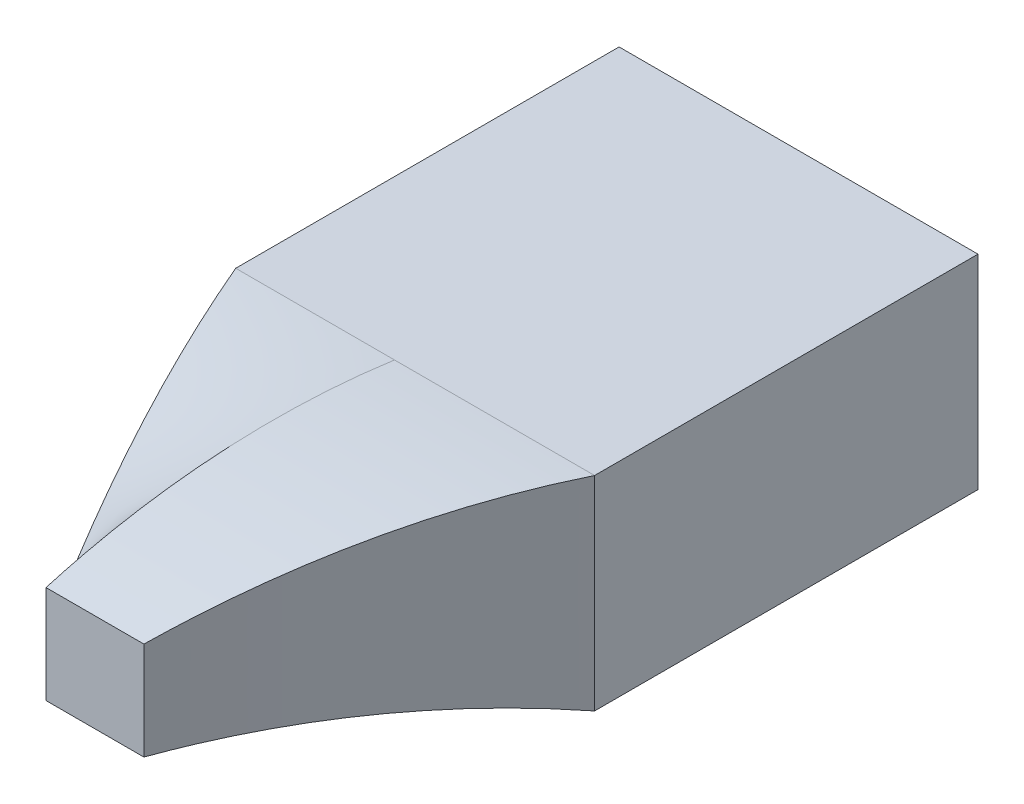
ISO-10303-21;
HEADER;
FILE_DESCRIPTION(('STEP AP214'),'2;1');
FILE_NAME('part.step','',(''),(''),'','','');
FILE_SCHEMA(('AUTOMOTIVE_DESIGN { 1 0 10303 214 1 1 1 1 }'));
ENDSEC;
DATA;
#1=APPLICATION_CONTEXT('core data for automotive mechanical design processes');
#2=APPLICATION_PROTOCOL_DEFINITION('international standard','automotive_design',2000,#1);
#3=PRODUCT_CONTEXT('',#1,'mechanical');
#4=PRODUCT('Part','Part','',(#3));
#5=PRODUCT_RELATED_PRODUCT_CATEGORY('part','',(#4));
#6=PRODUCT_DEFINITION_FORMATION('','',#4);
#7=PRODUCT_DEFINITION_CONTEXT('part definition',#1,'design');
#8=PRODUCT_DEFINITION('design','',#6,#7);
#9=PRODUCT_DEFINITION_SHAPE('','',#8);
#10=(LENGTH_UNIT() NAMED_UNIT(*) SI_UNIT(.MILLI.,.METRE.));
#11=(NAMED_UNIT(*) PLANE_ANGLE_UNIT() SI_UNIT($,.RADIAN.));
#12=(NAMED_UNIT(*) SI_UNIT($,.STERADIAN.) SOLID_ANGLE_UNIT());
#13=UNCERTAINTY_MEASURE_WITH_UNIT(LENGTH_MEASURE(1.E-05),#10,'distance_accuracy_value','');
#14=(GEOMETRIC_REPRESENTATION_CONTEXT(3) GLOBAL_UNCERTAINTY_ASSIGNED_CONTEXT((#13)) GLOBAL_UNIT_ASSIGNED_CONTEXT((#10,
#11,#12)) REPRESENTATION_CONTEXT('',''));
#15=CARTESIAN_POINT('',(0.,0.,0.));
#16=DIRECTION('',(0.,0.,1.));
#17=DIRECTION('',(1.,0.,0.));
#18=AXIS2_PLACEMENT_3D('',#15,#16,#17);
#19=CARTESIAN_POINT('',(-9.47058823529412,23.,-23.7352941176471));
#20=DIRECTION('',(-1.,0.,0.));
#21=DIRECTION('',(0.,-1.,0.));
#22=AXIS2_PLACEMENT_3D('',#19,#20,#21);
#23=PLANE('',#22);
#24=DIRECTION('',(0.,-1.,0.));
#25=VECTOR('',#24,1.);
#26=CARTESIAN_POINT('',(-9.47058823529412,23.,23.2647058823529));
#27=LINE('',#26,#25);
#28=CARTESIAN_POINT('',(-9.47058823529412,23.,23.2647058823529));
#29=VERTEX_POINT('',#28);
#30=CARTESIAN_POINT('',(-9.47058823529411,-2.,23.2647058823529));
#31=VERTEX_POINT('',#30);
#32=EDGE_CURVE('E213',#29,#31,#27,.T.);
#33=ORIENTED_EDGE('',*,*,#32,.F.);
#34=DIRECTION('',(0.,0.,1.));
#35=VECTOR('',#34,1.);
#36=CARTESIAN_POINT('',(-9.47058823529412,23.,-23.7352941176471));
#37=LINE('',#36,#35);
#38=CARTESIAN_POINT('',(-9.47058823529412,23.,-23.7352941176471));
#39=VERTEX_POINT('',#38);
#40=EDGE_CURVE('E13',#39,#29,#37,.T.);
#41=ORIENTED_EDGE('',*,*,#40,.F.);
#42=DIRECTION('',(0.,-1.,0.));
#43=VECTOR('',#42,1.);
#44=CARTESIAN_POINT('',(-9.47058823529412,23.,-23.7352941176471));
#45=LINE('',#44,#43);
#46=CARTESIAN_POINT('',(-9.47058823529411,-2.,-23.7352941176471));
#47=VERTEX_POINT('',#46);
#48=EDGE_CURVE('E217',#39,#47,#45,.T.);
#49=ORIENTED_EDGE('',*,*,#48,.T.);
#50=DIRECTION('',(0.,0.,1.));
#51=VECTOR('',#50,1.);
#52=CARTESIAN_POINT('',(-9.47058823529411,-2.,-23.7352941176471));
#53=LINE('',#52,#51);
#54=EDGE_CURVE('E144',#47,#31,#53,.T.);
#55=ORIENTED_EDGE('',*,*,#54,.T.);
#56=EDGE_LOOP('',(#33,#41,#49,#55));
#57=FACE_BOUND('',#56,.T.);
#58=ADVANCED_FACE('F109',(#57),#23,.T.);
#59=CARTESIAN_POINT('',(-9.47058823529412,23.,-23.7352941176471));
#60=DIRECTION('',(0.,1.,0.));
#61=DIRECTION('',(0.,0.,1.));
#62=AXIS2_PLACEMENT_3D('',#59,#60,#61);
#63=PLANE('',#62);
#64=DIRECTION('',(1.,0.,0.));
#65=VECTOR('',#64,1.);
#66=CARTESIAN_POINT('',(-9.47058823529412,23.,23.2647058823529));
#67=LINE('',#66,#65);
#68=CARTESIAN_POINT('',(34.5294117647059,23.,23.2647058823529));
#69=VERTEX_POINT('',#68);
#70=CARTESIAN_POINT('',(10.,23.,23.2647058823529));
#71=VERTEX_POINT('',#70);
#72=EDGE_CURVE('E220',#69,#71,#67,.F.);
#73=ORIENTED_EDGE('',*,*,#72,.F.);
#74=DIRECTION('',(0.,0.,1.));
#75=VECTOR('',#74,1.);
#76=CARTESIAN_POINT('',(34.5294117647059,23.,-23.7352941176471));
#77=LINE('',#76,#75);
#78=CARTESIAN_POINT('',(34.5294117647059,23.,-23.7352941176471));
#79=VERTEX_POINT('',#78);
#80=EDGE_CURVE('E119',#79,#69,#77,.T.);
#81=ORIENTED_EDGE('',*,*,#80,.F.);
#82=DIRECTION('',(-1.,0.,0.));
#83=VECTOR('',#82,1.);
#84=CARTESIAN_POINT('',(-9.47058823529412,23.,-23.7352941176471));
#85=LINE('',#84,#83);
#86=EDGE_CURVE('E226',#79,#39,#85,.T.);
#87=ORIENTED_EDGE('',*,*,#86,.T.);
#88=ORIENTED_EDGE('',*,*,#40,.T.);
#89=DIRECTION('',(-1.,0.,0.));
#90=VECTOR('',#89,1.);
#91=CARTESIAN_POINT('',(-9.47058823529412,23.,23.2647058823529));
#92=LINE('',#91,#90);
#93=EDGE_CURVE('E127',#71,#29,#92,.T.);
#94=ORIENTED_EDGE('',*,*,#93,.F.);
#95=EDGE_LOOP('',(#73,#81,#87,#88,#94));
#96=FACE_BOUND('',#95,.T.);
#97=ADVANCED_FACE('F390',(#96),#63,.T.);
#98=CARTESIAN_POINT('',(34.5294117647059,23.,-23.7352941176471));
#99=DIRECTION('',(1.,0.,0.));
#100=DIRECTION('',(0.,1.,0.));
#101=AXIS2_PLACEMENT_3D('',#98,#99,#100);
#102=PLANE('',#101);
#103=DIRECTION('',(0.,1.,0.));
#104=VECTOR('',#103,1.);
#105=CARTESIAN_POINT('',(34.5294117647059,23.,23.2647058823529));
#106=LINE('',#105,#104);
#107=CARTESIAN_POINT('',(34.5294117647059,-2.,23.2647058823529));
#108=VERTEX_POINT('',#107);
#109=EDGE_CURVE('E244',#108,#69,#106,.T.);
#110=ORIENTED_EDGE('',*,*,#109,.F.);
#111=DIRECTION('',(0.,0.,1.));
#112=VECTOR('',#111,1.);
#113=CARTESIAN_POINT('',(34.5294117647059,-2.,-23.7352941176471));
#114=LINE('',#113,#112);
#115=CARTESIAN_POINT('',(34.5294117647059,-2.,-23.7352941176471));
#116=VERTEX_POINT('',#115);
#117=EDGE_CURVE('E232',#116,#108,#114,.T.);
#118=ORIENTED_EDGE('',*,*,#117,.F.);
#119=DIRECTION('',(0.,1.,0.));
#120=VECTOR('',#119,1.);
#121=CARTESIAN_POINT('',(34.5294117647059,23.,-23.7352941176471));
#122=LINE('',#121,#120);
#123=EDGE_CURVE('E223',#116,#79,#122,.T.);
#124=ORIENTED_EDGE('',*,*,#123,.T.);
#125=ORIENTED_EDGE('',*,*,#80,.T.);
#126=EDGE_LOOP('',(#110,#118,#124,#125));
#127=FACE_BOUND('',#126,.T.);
#128=ADVANCED_FACE('F399',(#127),#102,.T.);
#129=CARTESIAN_POINT('',(-9.47058823529411,-2.,-23.7352941176471));
#130=DIRECTION('',(0.,-1.,0.));
#131=DIRECTION('',(0.,0.,-1.));
#132=AXIS2_PLACEMENT_3D('',#129,#130,#131);
#133=PLANE('',#132);
#134=DIRECTION('',(1.,0.,0.));
#135=VECTOR('',#134,1.);
#136=CARTESIAN_POINT('',(-9.47058823529411,-2.,23.2647058823529));
#137=LINE('',#136,#135);
#138=EDGE_CURVE('E113',#31,#108,#137,.T.);
#139=ORIENTED_EDGE('',*,*,#138,.F.);
#140=ORIENTED_EDGE('',*,*,#54,.F.);
#141=DIRECTION('',(1.,0.,0.));
#142=VECTOR('',#141,1.);
#143=CARTESIAN_POINT('',(-9.47058823529411,-2.,-23.7352941176471));
#144=LINE('',#143,#142);
#145=EDGE_CURVE('E219',#47,#116,#144,.T.);
#146=ORIENTED_EDGE('',*,*,#145,.T.);
#147=ORIENTED_EDGE('',*,*,#117,.T.);
#148=EDGE_LOOP('',(#139,#140,#146,#147));
#149=FACE_BOUND('',#148,.T.);
#150=ADVANCED_FACE('F401',(#149),#133,.T.);
#151=CARTESIAN_POINT('',(-7.47058823529412,21.,-23.7352941176471));
#152=DIRECTION('',(0.,0.,1.));
#153=DIRECTION('',(1.,0.,0.));
#154=AXIS2_PLACEMENT_3D('',#151,#152,#153);
#155=PLANE('',#154);
#156=DIRECTION('',(-1.,0.,0.));
#157=VECTOR('',#156,1.);
#158=CARTESIAN_POINT('',(32.5099901349896,0.00810633694322861,-23.7352941176471));
#159=LINE('',#158,#157);
#160=CARTESIAN_POINT('',(32.5099901349896,0.00810633694322757,-23.7352941176471));
#161=VERTEX_POINT('',#160);
#162=CARTESIAN_POINT('',(-7.4900098650104,0.00810633694322861,-23.7352941176471));
#163=VERTEX_POINT('',#162);
#164=EDGE_CURVE('E189',#161,#163,#159,.T.);
#165=ORIENTED_EDGE('',*,*,#164,.F.);
#166=DIRECTION('',(0.,-1.,0.));
#167=VECTOR('',#166,1.);
#168=CARTESIAN_POINT('',(32.5099901349896,21.0081063369432,-23.7352941176471));
#169=LINE('',#168,#167);
#170=CARTESIAN_POINT('',(32.5099901349896,21.0081063369432,-23.7352941176471));
#171=VERTEX_POINT('',#170);
#172=EDGE_CURVE('E181',#171,#161,#169,.T.);
#173=ORIENTED_EDGE('',*,*,#172,.F.);
#174=DIRECTION('',(1.,0.,0.));
#175=VECTOR('',#174,1.);
#176=CARTESIAN_POINT('',(32.5099901349896,21.0081063369432,-23.7352941176471));
#177=LINE('',#176,#175);
#178=CARTESIAN_POINT('',(-7.4900098650104,21.0081063369432,-23.7352941176471));
#179=VERTEX_POINT('',#178);
#180=EDGE_CURVE('E206',#179,#171,#177,.T.);
#181=ORIENTED_EDGE('',*,*,#180,.F.);
#182=DIRECTION('',(0.,1.,0.));
#183=VECTOR('',#182,1.);
#184=CARTESIAN_POINT('',(-7.4900098650104,21.0081063369432,-23.7352941176471));
#185=LINE('',#184,#183);
#186=EDGE_CURVE('E204',#163,#179,#185,.T.);
#187=ORIENTED_EDGE('',*,*,#186,.F.);
#188=EDGE_LOOP('',(#165,#173,#181,#187));
#189=FACE_BOUND('',#188,.T.);
#190=ORIENTED_EDGE('',*,*,#48,.F.);
#191=ORIENTED_EDGE('',*,*,#86,.F.);
#192=ORIENTED_EDGE('',*,*,#123,.F.);
#193=ORIENTED_EDGE('',*,*,#145,.F.);
#194=EDGE_LOOP('',(#190,#191,#192,#193));
#195=FACE_BOUND('',#194,.T.);
#196=ADVANCED_FACE('F111',(#189,#195),#155,.F.);
#197=CARTESIAN_POINT('',(32.5099901349896,21.0081063369432,23.2647058823529));
#198=DIRECTION('',(1.,0.,0.));
#199=DIRECTION('',(0.,0.,-1.));
#200=AXIS2_PLACEMENT_3D('',#197,#198,#199);
#201=PLANE('',#200);
#202=ORIENTED_EDGE('',*,*,#172,.T.);
#203=DIRECTION('',(0.,0.,-1.));
#204=VECTOR('',#203,1.);
#205=CARTESIAN_POINT('',(32.5099901349896,0.00810633694322861,23.2647058823529));
#206=LINE('',#205,#204);
#207=CARTESIAN_POINT('',(32.5099901349896,0.00810633694322861,23.2647058823529));
#208=VERTEX_POINT('',#207);
#209=EDGE_CURVE('E184',#208,#161,#206,.T.);
#210=ORIENTED_EDGE('',*,*,#209,.F.);
#211=DIRECTION('',(0.,-1.,0.));
#212=VECTOR('',#211,1.);
#213=CARTESIAN_POINT('',(32.5099901349896,21.0081063369432,23.2647058823529));
#214=LINE('',#213,#212);
#215=CARTESIAN_POINT('',(32.5099901349896,21.0081063369432,23.2647058823529));
#216=VERTEX_POINT('',#215);
#217=EDGE_CURVE('E211',#216,#208,#214,.T.);
#218=ORIENTED_EDGE('',*,*,#217,.F.);
#219=DIRECTION('',(0.,0.,-1.));
#220=VECTOR('',#219,1.);
#221=CARTESIAN_POINT('',(32.5099901349896,21.0081063369432,23.2647058823529));
#222=LINE('',#221,#220);
#223=EDGE_CURVE('E154',#216,#171,#222,.T.);
#224=ORIENTED_EDGE('',*,*,#223,.T.);
#225=EDGE_LOOP('',(#202,#210,#218,#224));
#226=FACE_BOUND('',#225,.T.);
#227=ADVANCED_FACE('F183',(#226),#201,.F.);
#228=CARTESIAN_POINT('',(32.5099901349896,21.0081063369432,23.2647058823529));
#229=DIRECTION('',(0.,1.,0.));
#230=DIRECTION('',(0.,0.,1.));
#231=AXIS2_PLACEMENT_3D('',#228,#229,#230);
#232=PLANE('',#231);
#233=ORIENTED_EDGE('',*,*,#180,.T.);
#234=ORIENTED_EDGE('',*,*,#223,.F.);
#235=DIRECTION('',(1.,0.,0.));
#236=VECTOR('',#235,1.);
#237=CARTESIAN_POINT('',(32.5099901349896,21.0081063369432,23.2647058823529));
#238=LINE('',#237,#236);
#239=CARTESIAN_POINT('',(-7.4900098650104,21.0081063369432,23.2647058823529));
#240=VERTEX_POINT('',#239);
#241=EDGE_CURVE('E200',#240,#216,#238,.T.);
#242=ORIENTED_EDGE('',*,*,#241,.F.);
#243=DIRECTION('',(0.,0.,-1.));
#244=VECTOR('',#243,1.);
#245=CARTESIAN_POINT('',(-7.4900098650104,21.0081063369432,23.2647058823529));
#246=LINE('',#245,#244);
#247=EDGE_CURVE('E214',#240,#179,#246,.T.);
#248=ORIENTED_EDGE('',*,*,#247,.T.);
#249=EDGE_LOOP('',(#233,#234,#242,#248));
#250=FACE_BOUND('',#249,.T.);
#251=ADVANCED_FACE('F325',(#250),#232,.F.);
#252=CARTESIAN_POINT('',(-7.4900098650104,21.0081063369432,23.2647058823529));
#253=DIRECTION('',(-1.,0.,0.));
#254=DIRECTION('',(0.,0.,1.));
#255=AXIS2_PLACEMENT_3D('',#252,#253,#254);
#256=PLANE('',#255);
#257=ORIENTED_EDGE('',*,*,#186,.T.);
#258=ORIENTED_EDGE('',*,*,#247,.F.);
#259=DIRECTION('',(0.,1.,0.));
#260=VECTOR('',#259,1.);
#261=CARTESIAN_POINT('',(-7.4900098650104,21.0081063369432,23.2647058823529));
#262=LINE('',#261,#260);
#263=CARTESIAN_POINT('',(-7.4900098650104,0.00810633694322757,23.2647058823529));
#264=VERTEX_POINT('',#263);
#265=EDGE_CURVE('E430',#264,#240,#262,.T.);
#266=ORIENTED_EDGE('',*,*,#265,.F.);
#267=DIRECTION('',(0.,0.,-1.));
#268=VECTOR('',#267,1.);
#269=CARTESIAN_POINT('',(-7.4900098650104,0.00810633694322861,23.2647058823529));
#270=LINE('',#269,#268);
#271=EDGE_CURVE('E199',#264,#163,#270,.T.);
#272=ORIENTED_EDGE('',*,*,#271,.T.);
#273=EDGE_LOOP('',(#257,#258,#266,#272));
#274=FACE_BOUND('',#273,.T.);
#275=ADVANCED_FACE('F420',(#274),#256,.F.);
#276=CARTESIAN_POINT('',(32.5099901349896,0.00810633694322861,23.2647058823529));
#277=DIRECTION('',(0.,-1.,0.));
#278=DIRECTION('',(0.,0.,-1.));
#279=AXIS2_PLACEMENT_3D('',#276,#277,#278);
#280=PLANE('',#279);
#281=ORIENTED_EDGE('',*,*,#164,.T.);
#282=ORIENTED_EDGE('',*,*,#271,.F.);
#283=DIRECTION('',(-1.,0.,0.));
#284=VECTOR('',#283,1.);
#285=CARTESIAN_POINT('',(32.5099901349896,0.00810633694322861,23.2647058823529));
#286=LINE('',#285,#284);
#287=EDGE_CURVE('E197',#208,#264,#286,.T.);
#288=ORIENTED_EDGE('',*,*,#287,.F.);
#289=ORIENTED_EDGE('',*,*,#209,.T.);
#290=EDGE_LOOP('',(#281,#282,#288,#289));
#291=FACE_BOUND('',#290,.T.);
#292=ADVANCED_FACE('F193',(#291),#280,.F.);
#293=CARTESIAN_POINT('',(0.,0.,23.2647058823529));
#294=DIRECTION('',(0.,0.,1.));
#295=DIRECTION('',(1.,0.,0.));
#296=AXIS2_PLACEMENT_3D('',#293,#294,#295);
#297=PLANE('',#296);
#298=ORIENTED_EDGE('',*,*,#265,.T.);
#299=ORIENTED_EDGE('',*,*,#241,.T.);
#300=ORIENTED_EDGE('',*,*,#217,.T.);
#301=ORIENTED_EDGE('',*,*,#287,.T.);
#302=EDGE_LOOP('',(#298,#299,#300,#301));
#303=FACE_BOUND('',#302,.T.);
#304=ADVANCED_FACE('F323',(#303),#297,.F.);
#305=CARTESIAN_POINT('',(0.,0.,60.));
#306=DIRECTION('',(0.,0.,1.));
#307=DIRECTION('',(1.,0.,0.));
#308=AXIS2_PLACEMENT_3D('',#305,#306,#307);
#309=PLANE('',#308);
#310=DIRECTION('',(0.,-1.,0.));
#311=VECTOR('',#310,1.);
#312=CARTESIAN_POINT('',(4.01176250764008,14.2122527953122,60.));
#313=LINE('',#312,#311);
#314=CARTESIAN_POINT('',(4.01176250764008,14.2122527953122,60.));
#315=VERTEX_POINT('',#314);
#316=CARTESIAN_POINT('',(4.01176250764009,8.95828454134398,60.));
#317=VERTEX_POINT('',#316);
#318=EDGE_CURVE('E354',#315,#317,#313,.T.);
#319=ORIENTED_EDGE('',*,*,#318,.T.);
#320=CARTESIAN_POINT('',(4.01176250764009,2.21225279531223,60.));
#321=VERTEX_POINT('',#320);
#322=EDGE_CURVE('E363',#317,#321,#313,.T.);
#323=ORIENTED_EDGE('',*,*,#322,.T.);
#324=DIRECTION('',(1.,0.,0.));
#325=VECTOR('',#324,1.);
#326=CARTESIAN_POINT('',(4.01176250764009,2.21225279531223,60.));
#327=LINE('',#326,#325);
#328=CARTESIAN_POINT('',(16.0117625076401,2.21225279531223,60.));
#329=VERTEX_POINT('',#328);
#330=EDGE_CURVE('E362',#321,#329,#327,.T.);
#331=ORIENTED_EDGE('',*,*,#330,.T.);
#332=DIRECTION('',(0.,1.,0.));
#333=VECTOR('',#332,1.);
#334=CARTESIAN_POINT('',(16.0117625076401,14.2122527953122,60.));
#335=LINE('',#334,#333);
#336=CARTESIAN_POINT('',(16.0117625076401,14.2122527953122,60.));
#337=VERTEX_POINT('',#336);
#338=EDGE_CURVE('E266',#329,#337,#335,.T.);
#339=ORIENTED_EDGE('',*,*,#338,.T.);
#340=DIRECTION('',(-1.,0.,0.));
#341=VECTOR('',#340,1.);
#342=CARTESIAN_POINT('',(4.01176250764008,14.2122527953122,60.));
#343=LINE('',#342,#341);
#344=EDGE_CURVE('E291',#337,#315,#343,.T.);
#345=ORIENTED_EDGE('',*,*,#344,.T.);
#346=EDGE_LOOP('',(#319,#323,#331,#339,#345));
#347=FACE_BOUND('',#346,.T.);
#348=ADVANCED_FACE('F310',(#347),#309,.T.);
#349=CARTESIAN_POINT('',(34.5294117647059,23.,23.2647058823529));
#350=CARTESIAN_POINT('',(28.3568620123506,23.0908762159114,36.0649003432713));
#351=CARTESIAN_POINT('',(22.1843122599953,20.0721122432668,48.6718597414584));
#352=CARTESIAN_POINT('',(16.0117625076401,14.2122527953122,60.));
#353=CARTESIAN_POINT('',(32.4852941176471,23.,23.2647058823529));
#354=CARTESIAN_POINT('',(26.6607835809781,23.0908762159114,36.0649003432713));
#355=CARTESIAN_POINT('',(20.8362730443091,20.0721122432668,48.6718597414584));
#356=CARTESIAN_POINT('',(15.0117625076401,14.2122527953122,60.));
#357=CARTESIAN_POINT('',(28.3970588235294,23.,23.2647058823529));
#358=CARTESIAN_POINT('',(23.268626718233,23.0908762159114,36.0649003432713));
#359=CARTESIAN_POINT('',(18.1401946129365,20.0721122432668,48.6718597414584));
#360=CARTESIAN_POINT('',(13.0117625076401,14.2122527953122,60.));
#361=CARTESIAN_POINT('',(22.2647058823529,23.,23.2647058823529));
#362=CARTESIAN_POINT('',(18.1803914241153,23.0908762159114,36.0649003432712));
#363=CARTESIAN_POINT('',(14.0960769658777,20.0721122432668,48.6718597414584));
#364=CARTESIAN_POINT('',(10.0117625076401,14.2122527953122,60.));
#365=CARTESIAN_POINT('',(16.1323529411765,23.,23.264705882353));
#366=CARTESIAN_POINT('',(13.0921561299977,23.0908762159114,36.0649003432713));
#367=CARTESIAN_POINT('',(10.0519593188189,20.0721122432668,48.6718597414584));
#368=CARTESIAN_POINT('',(7.01176250764008,14.2122527953122,60.));
#369=CARTESIAN_POINT('',(12.0441176470588,23.,23.2647058823529));
#370=CARTESIAN_POINT('',(9.69999926725258,23.0908762159114,36.0649003432713));
#371=CARTESIAN_POINT('',(7.35588088744633,20.0721122432668,48.6718597414584));
#372=CARTESIAN_POINT('',(5.01176250764009,14.2122527953122,60.));
#373=CARTESIAN_POINT('',(10.,23.,23.2647058823529));
#374=CARTESIAN_POINT('',(8.00392083588003,23.0908762159114,36.0649003432713));
#375=CARTESIAN_POINT('',(6.00784167176006,20.0721122432668,48.6718597414584));
#376=CARTESIAN_POINT('',(4.01176250764008,14.2122527953122,60.));
#377=B_SPLINE_SURFACE_WITH_KNOTS('',3,3,((#349,#350,#351,#352),(#353,#354,#355,#356),(#357,#358,
#359,#360),(#361,#362,#363,#364),(#365,#366,#367,#368),(#369,#370,#371,#372),(#373,#374,#375,
#376)),.UNSPECIFIED.,.F.,.F.,.F.,(4,1,1,1,4),(4,4),(0.786125319693095,0.839593989769821,
0.893062659846547,0.946531329923274,1.),(0.,1.),.UNSPECIFIED.);
#378=CARTESIAN_POINT('',(10.,23.,23.2647058823529));
#379=CARTESIAN_POINT('',(8.00392083588003,23.0908762159114,36.0649003432713));
#380=CARTESIAN_POINT('',(6.00784167176006,20.0721122432668,48.6718597414584));
#381=CARTESIAN_POINT('',(4.01176250764008,14.2122527953122,60.));
#382=B_SPLINE_CURVE_WITH_KNOTS('',3,(#378,#379,#380,#381),.UNSPECIFIED.,.F.,.F.,(4,4),(0.,1.),.UNSPECIFIED.);
#383=EDGE_CURVE('E240',#71,#315,#382,.T.);
#384=CARTESIAN_POINT('',(34.5294117647059,23.,23.2647058823529));
#385=CARTESIAN_POINT('',(28.3568620123506,23.0908762159114,36.0649003432713));
#386=CARTESIAN_POINT('',(22.1843122599953,20.0721122432668,48.6718597414584));
#387=CARTESIAN_POINT('',(16.0117625076401,14.2122527953122,60.));
#388=B_SPLINE_CURVE_WITH_KNOTS('',3,(#384,#385,#386,#387),.UNSPECIFIED.,.F.,.F.,(4,4),(0.,1.),.UNSPECIFIED.);
#389=EDGE_CURVE('E268',#69,#337,#388,.T.);
#390=ORIENTED_EDGE('',*,*,#72,.T.);
#391=ORIENTED_EDGE('',*,*,#383,.T.);
#392=ORIENTED_EDGE('',*,*,#344,.F.);
#393=ORIENTED_EDGE('',*,*,#389,.F.);
#394=EDGE_LOOP('',(#390,#391,#392,#393));
#395=FACE_BOUND('',#394,.T.);
#396=ADVANCED_FACE('F298',(#395),#377,.T.);
#397=CARTESIAN_POINT('',(34.5294117647059,-2.,23.2647058823529));
#398=CARTESIAN_POINT('',(28.3568620123506,2.4242095492447,36.0649003432713));
#399=CARTESIAN_POINT('',(22.1843122599954,3.73877890993349,48.6718597414584));
#400=CARTESIAN_POINT('',(16.0117625076401,2.21225279531223,60.));
#401=CARTESIAN_POINT('',(34.5294117647059,0.083333333333334,23.2647058823529));
#402=CARTESIAN_POINT('',(28.3568620123506,4.14643177146693,36.0649003432713));
#403=CARTESIAN_POINT('',(22.1843122599954,5.0998900210446,48.6718597414584));
#404=CARTESIAN_POINT('',(16.0117625076401,3.21225279531224,60.));
#405=CARTESIAN_POINT('',(34.5294117647059,4.25000000000001,23.264705882353));
#406=CARTESIAN_POINT('',(28.3568620123507,7.59087621591138,36.0649003432713));
#407=CARTESIAN_POINT('',(22.1843122599954,7.82211224326684,48.6718597414584));
#408=CARTESIAN_POINT('',(16.0117625076401,5.21225279531225,60.));
#409=CARTESIAN_POINT('',(34.5294117647058,10.5,23.2647058823529));
#410=CARTESIAN_POINT('',(28.3568620123506,12.757542882578,36.0649003432712));
#411=CARTESIAN_POINT('',(22.1843122599953,11.9054455766001,48.6718597414583));
#412=CARTESIAN_POINT('',(16.0117625076401,8.21225279531222,60.));
#413=CARTESIAN_POINT('',(34.5294117647059,16.75,23.264705882353));
#414=CARTESIAN_POINT('',(28.3568620123506,17.9242095492447,36.0649003432713));
#415=CARTESIAN_POINT('',(22.1843122599954,15.9887789099335,48.6718597414584));
#416=CARTESIAN_POINT('',(16.0117625076401,11.2122527953122,60.));
#417=CARTESIAN_POINT('',(34.5294117647059,20.9166666666667,23.2647058823529));
#418=CARTESIAN_POINT('',(28.3568620123506,21.3686539936892,36.0649003432713));
#419=CARTESIAN_POINT('',(22.1843122599954,18.7110011321557,48.6718597414584));
#420=CARTESIAN_POINT('',(16.0117625076401,13.2122527953122,60.));
#421=CARTESIAN_POINT('',(34.5294117647059,23.,23.2647058823529));
#422=CARTESIAN_POINT('',(28.3568620123506,23.0908762159114,36.0649003432713));
#423=CARTESIAN_POINT('',(22.1843122599953,20.0721122432668,48.6718597414584));
#424=CARTESIAN_POINT('',(16.0117625076401,14.2122527953122,60.));
#425=B_SPLINE_SURFACE_WITH_KNOTS('',3,3,((#397,#398,#399,#400),(#401,#402,#403,#404),(#405,#406,
#407,#408),(#409,#410,#411,#412),(#413,#414,#415,#416),(#417,#418,#419,#420),(#421,#422,#423,
#424)),.UNSPECIFIED.,.F.,.F.,.F.,(4,1,1,1,4),(4,4),(0.570545609548167,0.624440537084399,
0.678335464620631,0.732230392156863,0.786125319693095),(0.,1.),.UNSPECIFIED.);
#426=CARTESIAN_POINT('',(34.5294117647059,-2.,23.2647058823529));
#427=CARTESIAN_POINT('',(28.3568620123506,2.4242095492447,36.0649003432713));
#428=CARTESIAN_POINT('',(22.1843122599954,3.73877890993349,48.6718597414584));
#429=CARTESIAN_POINT('',(16.0117625076401,2.21225279531223,60.));
#430=B_SPLINE_CURVE_WITH_KNOTS('',3,(#426,#427,#428,#429),.UNSPECIFIED.,.F.,.F.,(4,4),(0.,1.),.UNSPECIFIED.);
#431=EDGE_CURVE('E258',#108,#329,#430,.T.);
#432=ORIENTED_EDGE('',*,*,#109,.T.);
#433=ORIENTED_EDGE('',*,*,#389,.T.);
#434=ORIENTED_EDGE('',*,*,#338,.F.);
#435=ORIENTED_EDGE('',*,*,#431,.F.);
#436=EDGE_LOOP('',(#432,#433,#434,#435));
#437=FACE_BOUND('',#436,.T.);
#438=ADVANCED_FACE('F264',(#437),#425,.T.);
#439=CARTESIAN_POINT('',(-9.47058823529411,-2.,23.2647058823529));
#440=CARTESIAN_POINT('',(-4.97647132098271,2.4242095492447,36.0649003432713));
#441=CARTESIAN_POINT('',(-0.482354406671313,3.73877890993349,48.6718597414584));
#442=CARTESIAN_POINT('',(4.01176250764009,2.21225279531223,60.));
#443=CARTESIAN_POINT('',(-5.80392156862745,-2.,23.2647058823529));
#444=CARTESIAN_POINT('',(-2.19869354320494,2.4242095492447,36.0649003432713));
#445=CARTESIAN_POINT('',(1.40653448221758,3.73877890993349,48.6718597414584));
#446=CARTESIAN_POINT('',(5.01176250764009,2.21225279531223,60.));
#447=CARTESIAN_POINT('',(1.52941176470587,-2.,23.2647058823529));
#448=CARTESIAN_POINT('',(3.35686201235061,2.4242095492447,36.0649003432713));
#449=CARTESIAN_POINT('',(5.18431225999535,3.73877890993349,48.6718597414584));
#450=CARTESIAN_POINT('',(7.01176250764008,2.21225279531223,60.));
#451=CARTESIAN_POINT('',(12.5294117647059,-2.,23.2647058823529));
#452=CARTESIAN_POINT('',(11.690195345684,2.4242095492447,36.0649003432713));
#453=CARTESIAN_POINT('',(10.850978926662,3.73877890993349,48.6718597414584));
#454=CARTESIAN_POINT('',(10.0117625076401,2.21225279531223,60.0000000000001));
#455=CARTESIAN_POINT('',(23.5294117647059,-2.,23.2647058823529));
#456=CARTESIAN_POINT('',(20.0235286790173,2.42420954924471,36.0649003432712));
#457=CARTESIAN_POINT('',(16.5176455933287,3.73877890993349,48.6718597414583));
#458=CARTESIAN_POINT('',(13.0117625076401,2.21225279531223,59.9999999999999));
#459=CARTESIAN_POINT('',(30.8627450980392,-2.,23.2647058823529));
#460=CARTESIAN_POINT('',(25.5790842345728,2.4242095492447,36.0649003432713));
#461=CARTESIAN_POINT('',(20.2954233711065,3.73877890993349,48.6718597414584));
#462=CARTESIAN_POINT('',(15.0117625076401,2.21225279531223,60.));
#463=CARTESIAN_POINT('',(34.5294117647059,-2.,23.2647058823529));
#464=CARTESIAN_POINT('',(28.3568620123506,2.4242095492447,36.0649003432713));
#465=CARTESIAN_POINT('',(22.1843122599954,3.73877890993349,48.6718597414584));
#466=CARTESIAN_POINT('',(16.0117625076401,2.21225279531223,60.));
#467=B_SPLINE_SURFACE_WITH_KNOTS('',3,3,((#439,#440,#441,#442),(#443,#444,#445,#446),(#447,#448,
#449,#450),(#451,#452,#453,#454),(#455,#456,#457,#458),(#459,#460,#461,#462),(#463,#464,#465,
#466)),.UNSPECIFIED.,.F.,.F.,.F.,(4,1,1,1,4),(4,4),(0.286125319693095,0.357230392156863,
0.428335464620631,0.499440537084399,0.570545609548167),(0.,1.),.UNSPECIFIED.);
#468=CARTESIAN_POINT('',(-9.47058823529411,-2.,23.2647058823529));
#469=CARTESIAN_POINT('',(-4.97647132098271,2.4242095492447,36.0649003432713));
#470=CARTESIAN_POINT('',(-0.482354406671313,3.73877890993349,48.6718597414584));
#471=CARTESIAN_POINT('',(4.01176250764009,2.21225279531223,60.));
#472=B_SPLINE_CURVE_WITH_KNOTS('',3,(#468,#469,#470,#471),.UNSPECIFIED.,.F.,.F.,(4,4),(0.,1.),.UNSPECIFIED.);
#473=EDGE_CURVE('E261',#31,#321,#472,.T.);
#474=ORIENTED_EDGE('',*,*,#138,.T.);
#475=ORIENTED_EDGE('',*,*,#431,.T.);
#476=ORIENTED_EDGE('',*,*,#330,.F.);
#477=ORIENTED_EDGE('',*,*,#473,.F.);
#478=EDGE_LOOP('',(#474,#475,#476,#477));
#479=FACE_BOUND('',#478,.T.);
#480=ADVANCED_FACE('F255',(#479),#467,.T.);
#481=CARTESIAN_POINT('',(-9.47058823529412,23.,23.2647058823529));
#482=CARTESIAN_POINT('',(-4.97647132098272,21.3395534645886,36.0649003432713));
#483=CARTESIAN_POINT('',(-0.482354406671314,16.5694667406213,48.6718597414584));
#484=CARTESIAN_POINT('',(4.01176250764009,8.95828454134398,60.));
#485=CARTESIAN_POINT('',(-9.47058823529412,20.9166666666667,23.2647058823529));
#486=CARTESIAN_POINT('',(-4.97647132098272,19.7632748049766,36.0649003432713));
#487=CARTESIAN_POINT('',(-0.482354406671314,15.5002427547307,48.6718597414584));
#488=CARTESIAN_POINT('',(4.01176250764009,8.39611522917467,60.));
#489=CARTESIAN_POINT('',(-9.47058823529413,16.75,23.2647058823529));
#490=CARTESIAN_POINT('',(-4.97647132098272,16.6107174857526,36.0649003432712));
#491=CARTESIAN_POINT('',(-0.482354406671315,13.3617947829494,48.6718597414584));
#492=CARTESIAN_POINT('',(4.01176250764009,7.27177660483604,60.));
#493=CARTESIAN_POINT('',(-9.4705882352941,10.5,23.264705882353));
#494=CARTESIAN_POINT('',(-4.9764713209827,11.8818815069167,36.0649003432713));
#495=CARTESIAN_POINT('',(-0.482354406671313,10.1541228252774,48.6718597414584));
#496=CARTESIAN_POINT('',(4.01176250764008,5.58526866832811,60.));
#497=CARTESIAN_POINT('',(-9.47058823529413,4.24999999999999,23.2647058823529));
#498=CARTESIAN_POINT('',(-4.97647132098272,7.15304552808068,36.0649003432712));
#499=CARTESIAN_POINT('',(-0.482354406671315,6.94645086760544,48.6718597414583));
#500=CARTESIAN_POINT('',(4.01176250764009,3.89876073182016,59.9999999999999));
#501=CARTESIAN_POINT('',(-9.47058823529411,0.0833333333333319,23.2647058823529));
#502=CARTESIAN_POINT('',(-4.97647132098271,4.0004882088567,36.0649003432713));
#503=CARTESIAN_POINT('',(-0.482354406671313,4.80800289582414,48.6718597414584));
#504=CARTESIAN_POINT('',(4.01176250764009,2.77442210748155,60.));
#505=CARTESIAN_POINT('',(-9.47058823529411,-2.,23.2647058823529));
#506=CARTESIAN_POINT('',(-4.97647132098271,2.4242095492447,36.0649003432713));
#507=CARTESIAN_POINT('',(-0.482354406671313,3.73877890993349,48.6718597414584));
#508=CARTESIAN_POINT('',(4.01176250764009,2.21225279531223,60.));
#509=B_SPLINE_SURFACE_WITH_KNOTS('',3,3,((#481,#482,#483,#484),(#485,#486,#487,#488),(#489,#490,
#491,#492),(#493,#494,#495,#496),(#497,#498,#499,#500),(#501,#502,#503,#504),(#505,#506,#507,
#508)),.UNSPECIFIED.,.F.,.F.,.F.,(4,1,1,1,4),(4,4),(0.125274445527003,0.165487164068526,
0.205699882610049,0.245912601151572,0.286125319693095),(0.,1.),.UNSPECIFIED.);
#510=CARTESIAN_POINT('',(-9.47058823529412,23.,23.2647058823529));
#511=CARTESIAN_POINT('',(-4.97647132098272,21.3395534645886,36.0649003432713));
#512=CARTESIAN_POINT('',(-0.482354406671314,16.5694667406213,48.6718597414584));
#513=CARTESIAN_POINT('',(4.01176250764009,8.95828454134398,60.));
#514=B_SPLINE_CURVE_WITH_KNOTS('',3,(#510,#511,#512,#513),.UNSPECIFIED.,.F.,.F.,(4,4),(0.,1.),.UNSPECIFIED.);
#515=EDGE_CURVE('E271',#29,#317,#514,.T.);
#516=ORIENTED_EDGE('',*,*,#32,.T.);
#517=ORIENTED_EDGE('',*,*,#473,.T.);
#518=ORIENTED_EDGE('',*,*,#322,.F.);
#519=ORIENTED_EDGE('',*,*,#515,.F.);
#520=EDGE_LOOP('',(#516,#517,#518,#519));
#521=FACE_BOUND('',#520,.T.);
#522=ADVANCED_FACE('F384',(#521),#509,.T.);
#523=CARTESIAN_POINT('',(10.,23.,23.2647058823529));
#524=CARTESIAN_POINT('',(8.00392083588003,23.0908762159114,36.0649003432713));
#525=CARTESIAN_POINT('',(6.00784167176006,20.0721122432668,48.6718597414584));
#526=CARTESIAN_POINT('',(4.01176250764008,14.2122527953122,60.));
#527=CARTESIAN_POINT('',(8.37745098039216,23.,23.2647058823529));
#528=CARTESIAN_POINT('',(6.9222214894748,22.9449326533011,36.0649003432712));
#529=CARTESIAN_POINT('',(5.46699199855744,19.7802251180464,48.6718597414584));
#530=CARTESIAN_POINT('',(4.01176250764008,13.7744221074815,60.));
#531=CARTESIAN_POINT('',(5.13235294117647,23.,23.2647058823529));
#532=CARTESIAN_POINT('',(4.75882279666434,22.6530455280807,36.0649003432713));
#533=CARTESIAN_POINT('',(4.38529265215221,19.1964508676055,48.6718597414584));
#534=CARTESIAN_POINT('',(4.01176250764008,12.8987607318202,60.));
#535=CARTESIAN_POINT('',(0.264705882352943,23.,23.264705882353));
#536=CARTESIAN_POINT('',(1.51372475744866,22.21521484025,36.0649003432713));
#537=CARTESIAN_POINT('',(2.76274363254437,18.3207894919441,48.6718597414584));
#538=CARTESIAN_POINT('',(4.01176250764008,11.5852686683281,60.));
#539=CARTESIAN_POINT('',(-4.60294117647059,23.,23.2647058823529));
#540=CARTESIAN_POINT('',(-1.73137328176703,21.7773841524193,36.0649003432712));
#541=CARTESIAN_POINT('',(1.14019461293653,17.4451281162827,48.6718597414583));
#542=CARTESIAN_POINT('',(4.01176250764009,10.2717766048361,60.));
#543=CARTESIAN_POINT('',(-7.84803921568627,23.,23.2647058823529));
#544=CARTESIAN_POINT('',(-3.89477197457748,21.4854970271988,36.0649003432712));
#545=CARTESIAN_POINT('',(0.0584952665313004,16.8613538658418,48.6718597414584));
#546=CARTESIAN_POINT('',(4.01176250764009,9.39611522917467,60.));
#547=CARTESIAN_POINT('',(-9.47058823529412,23.,23.2647058823529));
#548=CARTESIAN_POINT('',(-4.97647132098272,21.3395534645886,36.0649003432713));
#549=CARTESIAN_POINT('',(-0.482354406671314,16.5694667406213,48.6718597414584));
#550=CARTESIAN_POINT('',(4.01176250764009,8.95828454134398,60.));
#551=B_SPLINE_SURFACE_WITH_KNOTS('',3,3,((#523,#524,#525,#526),(#527,#528,#529,#530),(#531,#532,
#533,#534),(#535,#536,#537,#538),(#539,#540,#541,#542),(#543,#544,#545,#546),(#547,#548,#549,
#550)),.UNSPECIFIED.,.F.,.F.,.F.,(4,1,1,1,4),(4,4),(0.,0.0313186113817508,0.0626372227635015,
0.0939558341452523,0.125274445527003),(0.,1.),.UNSPECIFIED.);
#552=ORIENTED_EDGE('',*,*,#93,.T.);
#553=ORIENTED_EDGE('',*,*,#515,.T.);
#554=ORIENTED_EDGE('',*,*,#318,.F.);
#555=ORIENTED_EDGE('',*,*,#383,.F.);
#556=EDGE_LOOP('',(#552,#553,#554,#555));
#557=FACE_BOUND('',#556,.T.);
#558=ADVANCED_FACE('F393',(#557),#551,.T.);
#559=CLOSED_SHELL('',(#58,#97,#128,#150,#196,#227,#251,#275,#292,#304,#348,#396,#438,#480,#522,#558));
#560=MANIFOLD_SOLID_BREP('B2',#559);
#561=ADVANCED_BREP_SHAPE_REPRESENTATION('',(#18,#560),#14);
#562=SHAPE_DEFINITION_REPRESENTATION(#9,#561);
ENDSEC;
END-ISO-10303-21;
